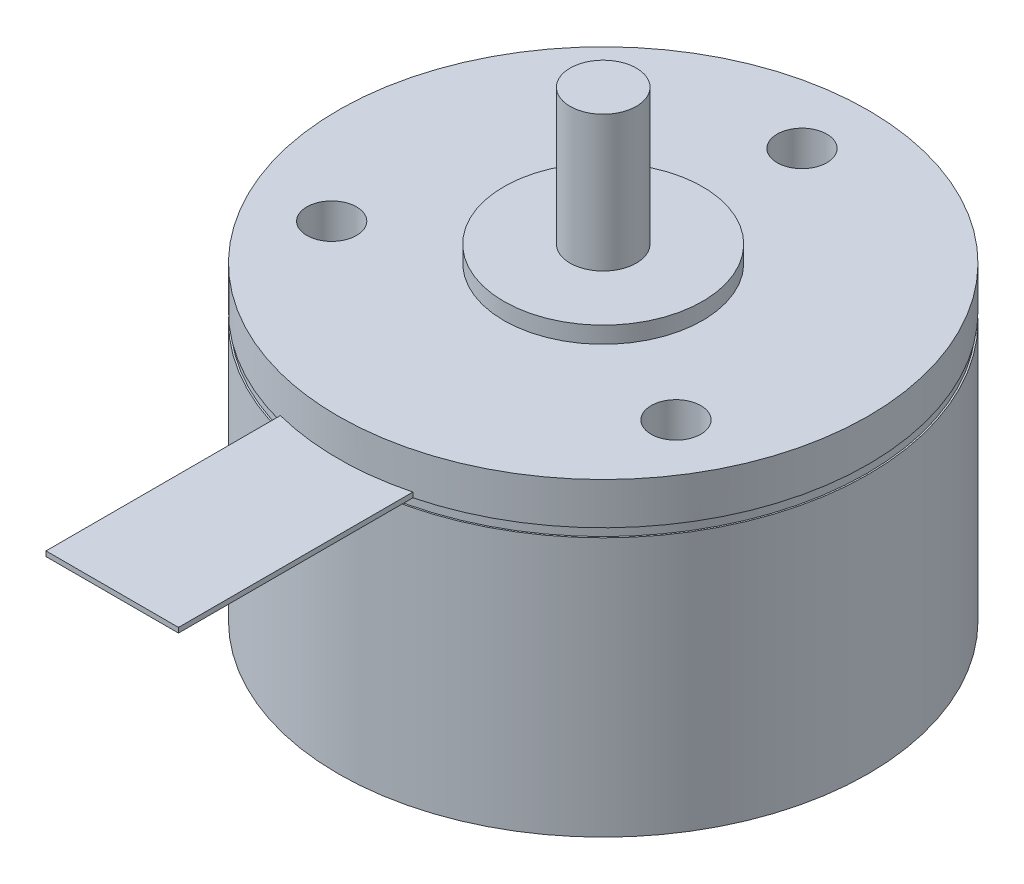
ISO-10303-21;
HEADER;
FILE_DESCRIPTION(('STEP AP214'),'2;1');
FILE_NAME('part.step','',(''),(''),'','','');
FILE_SCHEMA(('AUTOMOTIVE_DESIGN { 1 0 10303 214 1 1 1 1 }'));
ENDSEC;
DATA;
#1=APPLICATION_CONTEXT('core data for automotive mechanical design processes');
#2=APPLICATION_PROTOCOL_DEFINITION('international standard','automotive_design',2000,#1);
#3=PRODUCT_CONTEXT('',#1,'mechanical');
#4=PRODUCT('Part','Part','',(#3));
#5=PRODUCT_RELATED_PRODUCT_CATEGORY('part','',(#4));
#6=PRODUCT_DEFINITION_FORMATION('','',#4);
#7=PRODUCT_DEFINITION_CONTEXT('part definition',#1,'design');
#8=PRODUCT_DEFINITION('design','',#6,#7);
#9=PRODUCT_DEFINITION_SHAPE('','',#8);
#10=(LENGTH_UNIT() NAMED_UNIT(*) SI_UNIT(.MILLI.,.METRE.));
#11=(NAMED_UNIT(*) PLANE_ANGLE_UNIT() SI_UNIT($,.RADIAN.));
#12=(NAMED_UNIT(*) SI_UNIT($,.STERADIAN.) SOLID_ANGLE_UNIT());
#13=UNCERTAINTY_MEASURE_WITH_UNIT(LENGTH_MEASURE(1.E-05),#10,'distance_accuracy_value','');
#14=(GEOMETRIC_REPRESENTATION_CONTEXT(3) GLOBAL_UNCERTAINTY_ASSIGNED_CONTEXT((#13)) GLOBAL_UNIT_ASSIGNED_CONTEXT((#10,
#11,#12)) REPRESENTATION_CONTEXT('',''));
#15=CARTESIAN_POINT('',(0.,0.,0.));
#16=DIRECTION('',(0.,0.,1.));
#17=DIRECTION('',(1.,0.,0.));
#18=AXIS2_PLACEMENT_3D('',#15,#16,#17);
#19=CARTESIAN_POINT('',(0.,2.2,0.));
#20=DIRECTION('',(0.,-1.,0.));
#21=DIRECTION('',(0.,0.,-1.));
#22=AXIS2_PLACEMENT_3D('',#19,#20,#21);
#23=CYLINDRICAL_SURFACE('',#22,16.);
#24=CARTESIAN_POINT('',(0.,-0.322612836103582,0.));
#25=DIRECTION('',(0.,1.,0.));
#26=DIRECTION('',(0.,0.,1.));
#27=AXIS2_PLACEMENT_3D('',#24,#25,#26);
#28=CIRCLE('',#27,16.);
#29=CARTESIAN_POINT('',(4.,-0.322612836103584,15.4919333848297));
#30=VERTEX_POINT('',#29);
#31=CARTESIAN_POINT('',(-4.,-0.322612836103584,15.4919333848297));
#32=VERTEX_POINT('',#31);
#33=EDGE_CURVE('E133',#30,#32,#28,.T.);
#34=ORIENTED_EDGE('',*,*,#33,.T.);
#35=DIRECTION('',(0.,-1.,0.));
#36=VECTOR('',#35,1.);
#37=CARTESIAN_POINT('',(-4.,2.2,15.4919333848297));
#38=LINE('',#37,#36);
#39=CARTESIAN_POINT('',(-4.,-0.0226128361035832,15.4919333848297));
#40=VERTEX_POINT('',#39);
#41=EDGE_CURVE('E64',#32,#40,#38,.F.);
#42=ORIENTED_EDGE('',*,*,#41,.T.);
#43=CARTESIAN_POINT('',(0.,-0.0226128361035817,0.));
#44=DIRECTION('',(0.,-1.,0.));
#45=DIRECTION('',(0.,0.,-1.));
#46=AXIS2_PLACEMENT_3D('',#43,#44,#45);
#47=CIRCLE('',#46,16.);
#48=CARTESIAN_POINT('',(4.,-0.022612836103584,15.4919333848297));
#49=VERTEX_POINT('',#48);
#50=EDGE_CURVE('E11',#49,#40,#47,.T.);
#51=ORIENTED_EDGE('',*,*,#50,.F.);
#52=DIRECTION('',(0.,-1.,0.));
#53=VECTOR('',#52,1.);
#54=CARTESIAN_POINT('',(4.,2.2,15.4919333848297));
#55=LINE('',#54,#53);
#56=EDGE_CURVE('E93',#49,#30,#55,.T.);
#57=ORIENTED_EDGE('',*,*,#56,.T.);
#58=EDGE_LOOP('',(#34,#42,#51,#57));
#59=FACE_BOUND('',#58,.T.);
#60=CARTESIAN_POINT('',(0.,2.2,0.));
#61=DIRECTION('',(0.,1.,0.));
#62=DIRECTION('',(0.,0.,1.));
#63=AXIS2_PLACEMENT_3D('',#60,#61,#62);
#64=CIRCLE('',#63,16.);
#65=CARTESIAN_POINT('',(0.,2.2,16.));
#66=VERTEX_POINT('',#65);
#67=EDGE_CURVE('E155',#66,#66,#64,.T.);
#68=ORIENTED_EDGE('',*,*,#67,.F.);
#69=EDGE_LOOP('',(#68));
#70=FACE_BOUND('',#69,.T.);
#71=ADVANCED_FACE('F49',(#59,#70),#23,.T.);
#72=CARTESIAN_POINT('',(10.3923048454137,2.2,5.99999999999975));
#73=DIRECTION('',(0.,-1.,0.));
#74=DIRECTION('',(0.,0.,-1.));
#75=AXIS2_PLACEMENT_3D('',#72,#73,#74);
#76=CYLINDRICAL_SURFACE('',#75,1.5);
#77=CARTESIAN_POINT('',(10.3923048454137,2.2,5.99999999999975));
#78=DIRECTION('',(0.,1.,0.));
#79=DIRECTION('',(0.,0.,1.));
#80=AXIS2_PLACEMENT_3D('',#77,#78,#79);
#81=CIRCLE('',#80,1.5);
#82=CARTESIAN_POINT('',(10.3923048454137,2.2,7.49999999999975));
#83=VERTEX_POINT('',#82);
#84=EDGE_CURVE('E152',#83,#83,#81,.T.);
#85=ORIENTED_EDGE('',*,*,#84,.T.);
#86=EDGE_LOOP('',(#85));
#87=FACE_BOUND('',#86,.T.);
#88=CARTESIAN_POINT('',(10.3923048454137,0.,5.99999999999975));
#89=DIRECTION('',(0.,1.,0.));
#90=DIRECTION('',(0.,0.,1.));
#91=AXIS2_PLACEMENT_3D('',#88,#89,#90);
#92=CIRCLE('',#91,1.5);
#93=CARTESIAN_POINT('',(10.3923048454137,0.,7.49999999999975));
#94=VERTEX_POINT('',#93);
#95=EDGE_CURVE('E149',#94,#94,#92,.T.);
#96=ORIENTED_EDGE('',*,*,#95,.F.);
#97=EDGE_LOOP('',(#96));
#98=FACE_BOUND('',#97,.T.);
#99=ADVANCED_FACE('F169',(#87,#98),#76,.F.);
#100=CARTESIAN_POINT('',(0.,2.2,-12.));
#101=DIRECTION('',(0.,-1.,0.));
#102=DIRECTION('',(0.,0.,-1.));
#103=AXIS2_PLACEMENT_3D('',#100,#101,#102);
#104=CYLINDRICAL_SURFACE('',#103,1.5);
#105=CARTESIAN_POINT('',(0.,2.2,-12.));
#106=DIRECTION('',(0.,1.,0.));
#107=DIRECTION('',(0.,0.,1.));
#108=AXIS2_PLACEMENT_3D('',#105,#106,#107);
#109=CIRCLE('',#108,1.5);
#110=CARTESIAN_POINT('',(0.,2.2,-10.5));
#111=VERTEX_POINT('',#110);
#112=EDGE_CURVE('E148',#111,#111,#109,.T.);
#113=ORIENTED_EDGE('',*,*,#112,.T.);
#114=EDGE_LOOP('',(#113));
#115=FACE_BOUND('',#114,.T.);
#116=CARTESIAN_POINT('',(0.,0.,-12.));
#117=DIRECTION('',(0.,1.,0.));
#118=DIRECTION('',(0.,0.,1.));
#119=AXIS2_PLACEMENT_3D('',#116,#117,#118);
#120=CIRCLE('',#119,1.5);
#121=CARTESIAN_POINT('',(0.,0.,-10.5));
#122=VERTEX_POINT('',#121);
#123=EDGE_CURVE('E162',#122,#122,#120,.T.);
#124=ORIENTED_EDGE('',*,*,#123,.F.);
#125=EDGE_LOOP('',(#124));
#126=FACE_BOUND('',#125,.T.);
#127=ADVANCED_FACE('F171',(#115,#126),#104,.F.);
#128=CARTESIAN_POINT('',(-10.3923048454128,2.2,6.00000000000025));
#129=DIRECTION('',(0.,-1.,0.));
#130=DIRECTION('',(0.,0.,-1.));
#131=AXIS2_PLACEMENT_3D('',#128,#129,#130);
#132=CYLINDRICAL_SURFACE('',#131,1.5);
#133=CARTESIAN_POINT('',(-10.3923048454128,2.2,6.00000000000025));
#134=DIRECTION('',(0.,1.,0.));
#135=DIRECTION('',(0.,0.,1.));
#136=AXIS2_PLACEMENT_3D('',#133,#134,#135);
#137=CIRCLE('',#136,1.5);
#138=CARTESIAN_POINT('',(-10.3923048454128,2.2,7.50000000000025));
#139=VERTEX_POINT('',#138);
#140=EDGE_CURVE('E145',#139,#139,#137,.T.);
#141=ORIENTED_EDGE('',*,*,#140,.T.);
#142=EDGE_LOOP('',(#141));
#143=FACE_BOUND('',#142,.T.);
#144=CARTESIAN_POINT('',(-10.3923048454128,0.,6.00000000000025));
#145=DIRECTION('',(0.,1.,0.));
#146=DIRECTION('',(0.,0.,1.));
#147=AXIS2_PLACEMENT_3D('',#144,#145,#146);
#148=CIRCLE('',#147,1.5);
#149=CARTESIAN_POINT('',(-10.3923048454128,0.,7.50000000000025));
#150=VERTEX_POINT('',#149);
#151=EDGE_CURVE('E144',#150,#150,#148,.T.);
#152=ORIENTED_EDGE('',*,*,#151,.F.);
#153=EDGE_LOOP('',(#152));
#154=FACE_BOUND('',#153,.T.);
#155=ADVANCED_FACE('F51',(#143,#154),#132,.F.);
#156=CARTESIAN_POINT('',(0.,2.2,0.));
#157=DIRECTION('',(0.,1.,0.));
#158=DIRECTION('',(0.,0.,1.));
#159=AXIS2_PLACEMENT_3D('',#156,#157,#158);
#160=PLANE('',#159);
#161=ORIENTED_EDGE('',*,*,#140,.F.);
#162=EDGE_LOOP('',(#161));
#163=FACE_BOUND('',#162,.T.);
#164=ORIENTED_EDGE('',*,*,#112,.F.);
#165=EDGE_LOOP('',(#164));
#166=FACE_BOUND('',#165,.T.);
#167=ORIENTED_EDGE('',*,*,#84,.F.);
#168=EDGE_LOOP('',(#167));
#169=FACE_BOUND('',#168,.T.);
#170=ORIENTED_EDGE('',*,*,#67,.T.);
#171=EDGE_LOOP('',(#170));
#172=FACE_BOUND('',#171,.T.);
#173=CARTESIAN_POINT('',(0.,2.2,0.));
#174=DIRECTION('',(0.,1.,0.));
#175=DIRECTION('',(0.,0.,1.));
#176=AXIS2_PLACEMENT_3D('',#173,#174,#175);
#177=CIRCLE('',#176,6.);
#178=CARTESIAN_POINT('',(0.,2.2,6.));
#179=VERTEX_POINT('',#178);
#180=EDGE_CURVE('E57',#179,#179,#177,.T.);
#181=ORIENTED_EDGE('',*,*,#180,.F.);
#182=EDGE_LOOP('',(#181));
#183=FACE_BOUND('',#182,.T.);
#184=ADVANCED_FACE('F181',(#163,#166,#169,#172,#183),#160,.T.);
#185=CARTESIAN_POINT('',(0.,3.2,0.));
#186=DIRECTION('',(0.,-1.,0.));
#187=DIRECTION('',(0.,0.,-1.));
#188=AXIS2_PLACEMENT_3D('',#185,#186,#187);
#189=CYLINDRICAL_SURFACE('',#188,6.);
#190=ORIENTED_EDGE('',*,*,#180,.T.);
#191=EDGE_LOOP('',(#190));
#192=FACE_BOUND('',#191,.T.);
#193=CARTESIAN_POINT('',(0.,3.2,0.));
#194=DIRECTION('',(0.,1.,0.));
#195=DIRECTION('',(0.,0.,1.));
#196=AXIS2_PLACEMENT_3D('',#193,#194,#195);
#197=CIRCLE('',#196,6.);
#198=CARTESIAN_POINT('',(0.,3.2,6.));
#199=VERTEX_POINT('',#198);
#200=EDGE_CURVE('E141',#199,#199,#197,.T.);
#201=ORIENTED_EDGE('',*,*,#200,.F.);
#202=EDGE_LOOP('',(#201));
#203=FACE_BOUND('',#202,.T.);
#204=ADVANCED_FACE('F184',(#192,#203),#189,.T.);
#205=CARTESIAN_POINT('',(0.,3.2,0.));
#206=DIRECTION('',(0.,1.,0.));
#207=DIRECTION('',(0.,0.,1.));
#208=AXIS2_PLACEMENT_3D('',#205,#206,#207);
#209=PLANE('',#208);
#210=CARTESIAN_POINT('',(0.,3.2,0.));
#211=DIRECTION('',(0.,1.,0.));
#212=DIRECTION('',(0.,0.,1.));
#213=AXIS2_PLACEMENT_3D('',#210,#211,#212);
#214=CIRCLE('',#213,2.);
#215=CARTESIAN_POINT('',(0.,3.2,2.));
#216=VERTEX_POINT('',#215);
#217=EDGE_CURVE('E138',#216,#216,#214,.T.);
#218=ORIENTED_EDGE('',*,*,#217,.F.);
#219=EDGE_LOOP('',(#218));
#220=FACE_BOUND('',#219,.T.);
#221=ORIENTED_EDGE('',*,*,#200,.T.);
#222=EDGE_LOOP('',(#221));
#223=FACE_BOUND('',#222,.T.);
#224=ADVANCED_FACE('F188',(#220,#223),#209,.T.);
#225=CARTESIAN_POINT('',(0.,11.4,0.));
#226=DIRECTION('',(0.,1.,0.));
#227=DIRECTION('',(0.,0.,1.));
#228=AXIS2_PLACEMENT_3D('',#225,#226,#227);
#229=PLANE('',#228);
#230=CARTESIAN_POINT('',(0.,11.4,0.));
#231=DIRECTION('',(0.,1.,0.));
#232=DIRECTION('',(0.,0.,1.));
#233=AXIS2_PLACEMENT_3D('',#230,#231,#232);
#234=CIRCLE('',#233,2.);
#235=CARTESIAN_POINT('',(0.,11.4,2.));
#236=VERTEX_POINT('',#235);
#237=EDGE_CURVE('E135',#236,#236,#234,.T.);
#238=ORIENTED_EDGE('',*,*,#237,.T.);
#239=EDGE_LOOP('',(#238));
#240=FACE_BOUND('',#239,.T.);
#241=ADVANCED_FACE('F192',(#240),#229,.T.);
#242=CARTESIAN_POINT('',(0.,11.4,0.));
#243=DIRECTION('',(0.,-1.,0.));
#244=DIRECTION('',(0.,0.,-1.));
#245=AXIS2_PLACEMENT_3D('',#242,#243,#244);
#246=CYLINDRICAL_SURFACE('',#245,2.);
#247=ORIENTED_EDGE('',*,*,#217,.T.);
#248=EDGE_LOOP('',(#247));
#249=FACE_BOUND('',#248,.T.);
#250=ORIENTED_EDGE('',*,*,#237,.F.);
#251=EDGE_LOOP('',(#250));
#252=FACE_BOUND('',#251,.T.);
#253=ADVANCED_FACE('F194',(#249,#252),#246,.T.);
#254=CARTESIAN_POINT('',(0.,-16.5,-1.));
#255=DIRECTION('',(0.,1.,0.));
#256=DIRECTION('',(0.,0.,1.));
#257=AXIS2_PLACEMENT_3D('',#254,#255,#256);
#258=PLANE('',#257);
#259=CARTESIAN_POINT('',(0.,-16.5,0.));
#260=DIRECTION('',(0.,1.,0.));
#261=DIRECTION('',(0.,0.,1.));
#262=AXIS2_PLACEMENT_3D('',#259,#260,#261);
#263=CIRCLE('',#262,16.);
#264=CARTESIAN_POINT('',(0.,-16.5,16.));
#265=VERTEX_POINT('',#264);
#266=EDGE_CURVE('E121',#265,#265,#263,.T.);
#267=ORIENTED_EDGE('',*,*,#266,.F.);
#268=EDGE_LOOP('',(#267));
#269=FACE_BOUND('',#268,.T.);
#270=ADVANCED_FACE('F197',(#269),#258,.F.);
#271=CARTESIAN_POINT('',(0.,0.,0.));
#272=DIRECTION('',(0.,1.,0.));
#273=DIRECTION('',(0.,0.,1.));
#274=AXIS2_PLACEMENT_3D('',#271,#272,#273);
#275=CYLINDRICAL_SURFACE('',#274,16.);
#276=CARTESIAN_POINT('',(0.,-0.847381969451503,0.));
#277=DIRECTION('',(0.,1.,0.));
#278=DIRECTION('',(0.,0.,1.));
#279=AXIS2_PLACEMENT_3D('',#276,#277,#278);
#280=CIRCLE('',#279,16.);
#281=CARTESIAN_POINT('',(0.,-0.847381969451505,16.));
#282=VERTEX_POINT('',#281);
#283=EDGE_CURVE('E124',#282,#282,#280,.T.);
#284=ORIENTED_EDGE('',*,*,#283,.F.);
#285=EDGE_LOOP('',(#284));
#286=FACE_BOUND('',#285,.T.);
#287=ORIENTED_EDGE('',*,*,#266,.T.);
#288=EDGE_LOOP('',(#287));
#289=FACE_BOUND('',#288,.T.);
#290=ADVANCED_FACE('F218',(#286,#289),#275,.T.);
#291=CARTESIAN_POINT('',(0.,-0.847381969451501,-15.9091496825633));
#292=DIRECTION('',(0.,-1.,0.));
#293=DIRECTION('',(0.,0.,-1.));
#294=AXIS2_PLACEMENT_3D('',#291,#292,#293);
#295=PLANE('',#294);
#296=CARTESIAN_POINT('',(0.,-0.847381969451503,0.));
#297=DIRECTION('',(0.,1.,0.));
#298=DIRECTION('',(0.,0.,1.));
#299=AXIS2_PLACEMENT_3D('',#296,#297,#298);
#300=CIRCLE('',#299,15.9091496825633);
#301=CARTESIAN_POINT('',(0.,-0.847381969451505,15.9091496825633));
#302=VERTEX_POINT('',#301);
#303=EDGE_CURVE('E127',#302,#302,#300,.T.);
#304=ORIENTED_EDGE('',*,*,#303,.F.);
#305=EDGE_LOOP('',(#304));
#306=FACE_BOUND('',#305,.T.);
#307=ORIENTED_EDGE('',*,*,#283,.T.);
#308=EDGE_LOOP('',(#307));
#309=FACE_BOUND('',#308,.T.);
#310=ADVANCED_FACE('F214',(#306,#309),#295,.F.);
#311=CARTESIAN_POINT('',(0.,0.,0.));
#312=DIRECTION('',(0.,1.,0.));
#313=DIRECTION('',(0.,0.,1.));
#314=AXIS2_PLACEMENT_3D('',#311,#312,#313);
#315=CYLINDRICAL_SURFACE('',#314,15.9091496825633);
#316=CARTESIAN_POINT('',(0.,-0.322612836103582,0.));
#317=DIRECTION('',(0.,1.,0.));
#318=DIRECTION('',(0.,0.,1.));
#319=AXIS2_PLACEMENT_3D('',#316,#317,#318);
#320=CIRCLE('',#319,15.9091496825633);
#321=CARTESIAN_POINT('',(0.,-0.322612836103584,15.9091496825633));
#322=VERTEX_POINT('',#321);
#323=EDGE_CURVE('E130',#322,#322,#320,.T.);
#324=ORIENTED_EDGE('',*,*,#323,.F.);
#325=EDGE_LOOP('',(#324));
#326=FACE_BOUND('',#325,.T.);
#327=ORIENTED_EDGE('',*,*,#303,.T.);
#328=EDGE_LOOP('',(#327));
#329=FACE_BOUND('',#328,.T.);
#330=ADVANCED_FACE('F210',(#326,#329),#315,.T.);
#331=CARTESIAN_POINT('',(0.,-0.32261283610358,-15.9091496825633));
#332=DIRECTION('',(0.,1.,0.));
#333=DIRECTION('',(0.,0.,1.));
#334=AXIS2_PLACEMENT_3D('',#331,#332,#333);
#335=PLANE('',#334);
#336=ORIENTED_EDGE('',*,*,#33,.F.);
#337=DIRECTION('',(0.,0.,1.));
#338=VECTOR('',#337,1.);
#339=CARTESIAN_POINT('',(4.,-0.322612836103583,9.08096849739523));
#340=LINE('',#339,#338);
#341=CARTESIAN_POINT('',(4.,-0.322612836103586,29.6411962840195));
#342=VERTEX_POINT('',#341);
#343=EDGE_CURVE('E113',#30,#342,#340,.T.);
#344=ORIENTED_EDGE('',*,*,#343,.T.);
#345=DIRECTION('',(-1.,0.,0.));
#346=VECTOR('',#345,1.);
#347=CARTESIAN_POINT('',(4.,-0.322612836103586,29.6411962840195));
#348=LINE('',#347,#346);
#349=CARTESIAN_POINT('',(-4.,-0.322612836103585,29.6411962840195));
#350=VERTEX_POINT('',#349);
#351=EDGE_CURVE('E104',#342,#350,#348,.T.);
#352=ORIENTED_EDGE('',*,*,#351,.T.);
#353=DIRECTION('',(0.,0.,-1.));
#354=VECTOR('',#353,1.);
#355=CARTESIAN_POINT('',(-4.,-0.322612836103585,29.6411962840195));
#356=LINE('',#355,#354);
#357=EDGE_CURVE('E97',#350,#32,#356,.T.);
#358=ORIENTED_EDGE('',*,*,#357,.T.);
#359=EDGE_LOOP('',(#336,#344,#352,#358));
#360=FACE_BOUND('',#359,.T.);
#361=ORIENTED_EDGE('',*,*,#323,.T.);
#362=EDGE_LOOP('',(#361));
#363=FACE_BOUND('',#362,.T.);
#364=ADVANCED_FACE('F206',(#360,#363),#335,.F.);
#365=CARTESIAN_POINT('',(0.,0.,0.));
#366=DIRECTION('',(0.,-1.,0.));
#367=DIRECTION('',(0.,0.,-1.));
#368=AXIS2_PLACEMENT_3D('',#365,#366,#367);
#369=PLANE('',#368);
#370=ORIENTED_EDGE('',*,*,#151,.T.);
#371=EDGE_LOOP('',(#370));
#372=FACE_BOUND('',#371,.T.);
#373=ADVANCED_FACE('F202',(#372),#369,.F.);
#374=ORIENTED_EDGE('',*,*,#123,.T.);
#375=EDGE_LOOP('',(#374));
#376=FACE_BOUND('',#375,.T.);
#377=ADVANCED_FACE('F205',(#376),#369,.F.);
#378=ORIENTED_EDGE('',*,*,#95,.T.);
#379=EDGE_LOOP('',(#378));
#380=FACE_BOUND('',#379,.T.);
#381=ADVANCED_FACE('F167',(#380),#369,.F.);
#382=CARTESIAN_POINT('',(0.,-0.0226128361035819,0.));
#383=DIRECTION('',(0.,-1.,0.));
#384=DIRECTION('',(0.,0.,-1.));
#385=AXIS2_PLACEMENT_3D('',#382,#383,#384);
#386=PLANE('',#385);
#387=DIRECTION('',(0.,0.,1.));
#388=VECTOR('',#387,1.);
#389=CARTESIAN_POINT('',(4.,-0.0226128361035833,9.08096849739523));
#390=LINE('',#389,#388);
#391=CARTESIAN_POINT('',(4.,-0.0226128361035858,29.6411962840195));
#392=VERTEX_POINT('',#391);
#393=EDGE_CURVE('E87',#49,#392,#390,.T.);
#394=ORIENTED_EDGE('',*,*,#393,.F.);
#395=ORIENTED_EDGE('',*,*,#50,.T.);
#396=DIRECTION('',(0.,0.,-1.));
#397=VECTOR('',#396,1.);
#398=CARTESIAN_POINT('',(-4.,-0.022612836103585,29.6411962840195));
#399=LINE('',#398,#397);
#400=CARTESIAN_POINT('',(-4.,-0.022612836103585,29.6411962840195));
#401=VERTEX_POINT('',#400);
#402=EDGE_CURVE('E106',#401,#40,#399,.T.);
#403=ORIENTED_EDGE('',*,*,#402,.F.);
#404=DIRECTION('',(-1.,0.,0.));
#405=VECTOR('',#404,1.);
#406=CARTESIAN_POINT('',(4.,-0.0226128361035858,29.6411962840195));
#407=LINE('',#406,#405);
#408=EDGE_CURVE('E96',#392,#401,#407,.T.);
#409=ORIENTED_EDGE('',*,*,#408,.F.);
#410=EDGE_LOOP('',(#394,#395,#403,#409));
#411=FACE_BOUND('',#410,.T.);
#412=ADVANCED_FACE('F108',(#411),#386,.F.);
#413=CARTESIAN_POINT('',(-4.,-0.022612836103585,29.6411962840195));
#414=DIRECTION('',(-1.,0.,0.));
#415=DIRECTION('',(0.,-1.,0.));
#416=AXIS2_PLACEMENT_3D('',#413,#414,#415);
#417=PLANE('',#416);
#418=ORIENTED_EDGE('',*,*,#41,.F.);
#419=ORIENTED_EDGE('',*,*,#357,.F.);
#420=DIRECTION('',(0.,-1.,0.));
#421=VECTOR('',#420,1.);
#422=CARTESIAN_POINT('',(-4.,-0.022612836103585,29.6411962840195));
#423=LINE('',#422,#421);
#424=EDGE_CURVE('E105',#401,#350,#423,.T.);
#425=ORIENTED_EDGE('',*,*,#424,.F.);
#426=ORIENTED_EDGE('',*,*,#402,.T.);
#427=EDGE_LOOP('',(#418,#419,#425,#426));
#428=FACE_BOUND('',#427,.T.);
#429=ADVANCED_FACE('F228',(#428),#417,.T.);
#430=CARTESIAN_POINT('',(4.,-0.0226128361035833,9.08096849739523));
#431=DIRECTION('',(1.,0.,0.));
#432=DIRECTION('',(0.,0.,-1.));
#433=AXIS2_PLACEMENT_3D('',#430,#431,#432);
#434=PLANE('',#433);
#435=ORIENTED_EDGE('',*,*,#56,.F.);
#436=ORIENTED_EDGE('',*,*,#393,.T.);
#437=DIRECTION('',(0.,-1.,0.));
#438=VECTOR('',#437,1.);
#439=CARTESIAN_POINT('',(4.,-0.0226128361035858,29.6411962840195));
#440=LINE('',#439,#438);
#441=EDGE_CURVE('E91',#392,#342,#440,.T.);
#442=ORIENTED_EDGE('',*,*,#441,.T.);
#443=ORIENTED_EDGE('',*,*,#343,.F.);
#444=EDGE_LOOP('',(#435,#436,#442,#443));
#445=FACE_BOUND('',#444,.T.);
#446=ADVANCED_FACE('F89',(#445),#434,.T.);
#447=CARTESIAN_POINT('',(4.,-0.0226128361035858,29.6411962840195));
#448=DIRECTION('',(0.,0.,1.));
#449=DIRECTION('',(0.,-1.,0.));
#450=AXIS2_PLACEMENT_3D('',#447,#448,#449);
#451=PLANE('',#450);
#452=ORIENTED_EDGE('',*,*,#351,.F.);
#453=ORIENTED_EDGE('',*,*,#441,.F.);
#454=ORIENTED_EDGE('',*,*,#408,.T.);
#455=ORIENTED_EDGE('',*,*,#424,.T.);
#456=EDGE_LOOP('',(#452,#453,#454,#455));
#457=FACE_BOUND('',#456,.T.);
#458=ADVANCED_FACE('F101',(#457),#451,.T.);
#459=CLOSED_SHELL('',(#71,#99,#127,#155,#184,#204,#224,#241,#253,#270,#290,#310,#330,#364,#373,
#377,#381,#412,#429,#446,#458));
#460=MANIFOLD_SOLID_BREP('B2',#459);
#461=ADVANCED_BREP_SHAPE_REPRESENTATION('',(#18,#460),#14);
#462=SHAPE_DEFINITION_REPRESENTATION(#9,#461);
ENDSEC;
END-ISO-10303-21;
